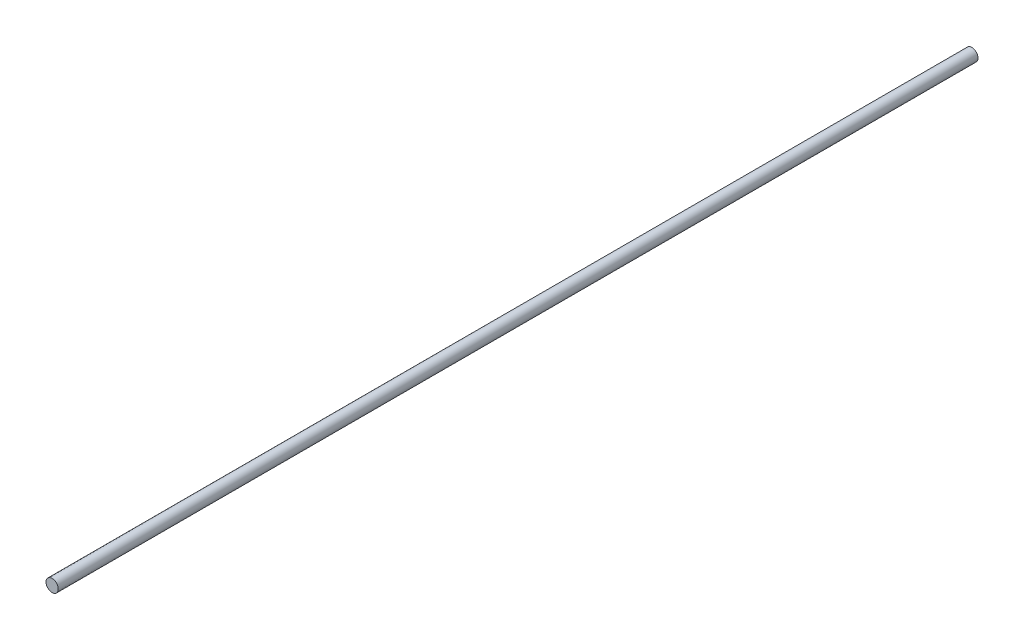
ISO-10303-21;
HEADER;
FILE_DESCRIPTION(('STEP AP214'),'2;1');
FILE_NAME('part.step','',(''),(''),'','','');
FILE_SCHEMA(('AUTOMOTIVE_DESIGN { 1 0 10303 214 1 1 1 1 }'));
ENDSEC;
DATA;
#1=APPLICATION_CONTEXT('core data for automotive mechanical design processes');
#2=APPLICATION_PROTOCOL_DEFINITION('international standard','automotive_design',2000,#1);
#3=PRODUCT_CONTEXT('',#1,'mechanical');
#4=PRODUCT('Part','Part','',(#3));
#5=PRODUCT_RELATED_PRODUCT_CATEGORY('part','',(#4));
#6=PRODUCT_DEFINITION_FORMATION('','',#4);
#7=PRODUCT_DEFINITION_CONTEXT('part definition',#1,'design');
#8=PRODUCT_DEFINITION('design','',#6,#7);
#9=PRODUCT_DEFINITION_SHAPE('','',#8);
#10=(LENGTH_UNIT() NAMED_UNIT(*) SI_UNIT(.MILLI.,.METRE.));
#11=(NAMED_UNIT(*) PLANE_ANGLE_UNIT() SI_UNIT($,.RADIAN.));
#12=(NAMED_UNIT(*) SI_UNIT($,.STERADIAN.) SOLID_ANGLE_UNIT());
#13=UNCERTAINTY_MEASURE_WITH_UNIT(LENGTH_MEASURE(1.E-05),#10,'distance_accuracy_value','');
#14=(GEOMETRIC_REPRESENTATION_CONTEXT(3) GLOBAL_UNCERTAINTY_ASSIGNED_CONTEXT((#13)) GLOBAL_UNIT_ASSIGNED_CONTEXT((#10,
#11,#12)) REPRESENTATION_CONTEXT('',''));
#15=CARTESIAN_POINT('',(0.,0.,0.));
#16=DIRECTION('',(0.,0.,1.));
#17=DIRECTION('',(1.,0.,0.));
#18=AXIS2_PLACEMENT_3D('',#15,#16,#17);
#19=CARTESIAN_POINT('',(0.,0.,300.));
#20=DIRECTION('',(0.,0.,-1.));
#21=DIRECTION('',(-1.,0.,0.));
#22=AXIS2_PLACEMENT_3D('',#19,#20,#21);
#23=CYLINDRICAL_SURFACE('',#22,2.);
#24=CARTESIAN_POINT('',(0.,0.,300.));
#25=DIRECTION('',(0.,0.,1.));
#26=DIRECTION('',(1.,0.,0.));
#27=AXIS2_PLACEMENT_3D('',#24,#25,#26);
#28=CIRCLE('',#27,2.);
#29=CARTESIAN_POINT('',(2.,0.,300.));
#30=VERTEX_POINT('',#29);
#31=EDGE_CURVE('E10',#30,#30,#28,.T.);
#32=ORIENTED_EDGE('',*,*,#31,.F.);
#33=EDGE_LOOP('',(#32));
#34=FACE_BOUND('',#33,.T.);
#35=CARTESIAN_POINT('',(0.,0.,0.));
#36=DIRECTION('',(0.,0.,1.));
#37=DIRECTION('',(1.,0.,0.));
#38=AXIS2_PLACEMENT_3D('',#35,#36,#37);
#39=CIRCLE('',#38,2.);
#40=CARTESIAN_POINT('',(2.,0.,0.));
#41=VERTEX_POINT('',#40);
#42=EDGE_CURVE('E42',#41,#41,#39,.T.);
#43=ORIENTED_EDGE('',*,*,#42,.T.);
#44=EDGE_LOOP('',(#43));
#45=FACE_BOUND('',#44,.T.);
#46=ADVANCED_FACE('F39',(#34,#45),#23,.T.);
#47=CARTESIAN_POINT('',(0.,0.,300.));
#48=DIRECTION('',(0.,0.,1.));
#49=DIRECTION('',(1.,0.,0.));
#50=AXIS2_PLACEMENT_3D('',#47,#48,#49);
#51=PLANE('',#50);
#52=ORIENTED_EDGE('',*,*,#31,.T.);
#53=EDGE_LOOP('',(#52));
#54=FACE_BOUND('',#53,.T.);
#55=ADVANCED_FACE('F54',(#54),#51,.T.);
#56=CARTESIAN_POINT('',(0.,0.,0.));
#57=DIRECTION('',(0.,0.,1.));
#58=DIRECTION('',(1.,0.,0.));
#59=AXIS2_PLACEMENT_3D('',#56,#57,#58);
#60=PLANE('',#59);
#61=ORIENTED_EDGE('',*,*,#42,.F.);
#62=EDGE_LOOP('',(#61));
#63=FACE_BOUND('',#62,.T.);
#64=ADVANCED_FACE('F52',(#63),#60,.F.);
#65=CLOSED_SHELL('',(#46,#55,#64));
#66=MANIFOLD_SOLID_BREP('B2',#65);
#67=ADVANCED_BREP_SHAPE_REPRESENTATION('',(#18,#66),#14);
#68=SHAPE_DEFINITION_REPRESENTATION(#9,#67);
ENDSEC;
END-ISO-10303-21;
